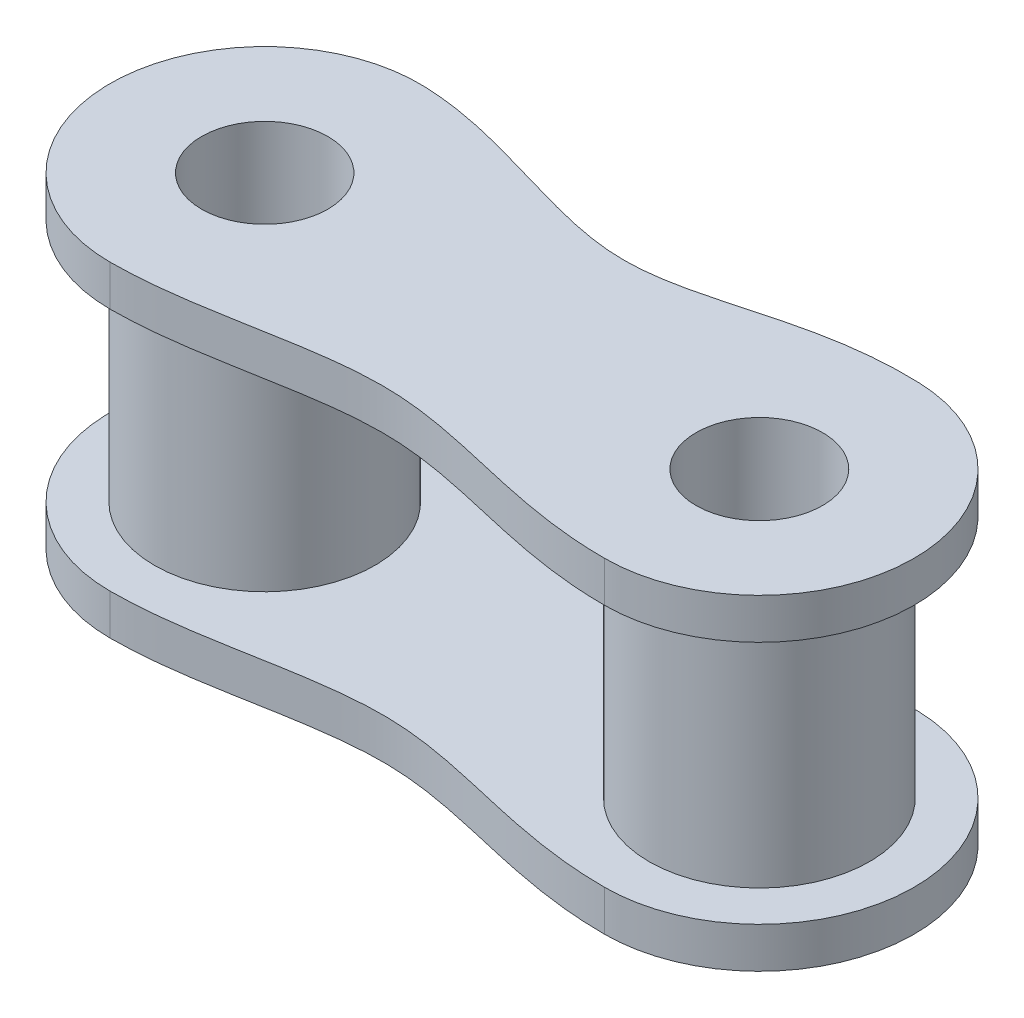
ISO-10303-21;
HEADER;
FILE_DESCRIPTION(('STEP AP214'),'2;1');
FILE_NAME('part.step','',(''),(''),'','','');
FILE_SCHEMA(('AUTOMOTIVE_DESIGN { 1 0 10303 214 1 1 1 1 }'));
ENDSEC;
DATA;
#1=APPLICATION_CONTEXT('core data for automotive mechanical design processes');
#2=APPLICATION_PROTOCOL_DEFINITION('international standard','automotive_design',2000,#1);
#3=PRODUCT_CONTEXT('',#1,'mechanical');
#4=PRODUCT('Part','Part','',(#3));
#5=PRODUCT_RELATED_PRODUCT_CATEGORY('part','',(#4));
#6=PRODUCT_DEFINITION_FORMATION('','',#4);
#7=PRODUCT_DEFINITION_CONTEXT('part definition',#1,'design');
#8=PRODUCT_DEFINITION('design','',#6,#7);
#9=PRODUCT_DEFINITION_SHAPE('','',#8);
#10=(LENGTH_UNIT() NAMED_UNIT(*) SI_UNIT(.MILLI.,.METRE.));
#11=(NAMED_UNIT(*) PLANE_ANGLE_UNIT() SI_UNIT($,.RADIAN.));
#12=(NAMED_UNIT(*) SI_UNIT($,.STERADIAN.) SOLID_ANGLE_UNIT());
#13=UNCERTAINTY_MEASURE_WITH_UNIT(LENGTH_MEASURE(1.E-05),#10,'distance_accuracy_value','');
#14=(GEOMETRIC_REPRESENTATION_CONTEXT(3) GLOBAL_UNCERTAINTY_ASSIGNED_CONTEXT((#13)) GLOBAL_UNIT_ASSIGNED_CONTEXT((#10,
#11,#12)) REPRESENTATION_CONTEXT('',''));
#15=CARTESIAN_POINT('',(0.,0.,0.));
#16=DIRECTION('',(0.,0.,1.));
#17=DIRECTION('',(1.,0.,0.));
#18=AXIS2_PLACEMENT_3D('',#15,#16,#17);
#19=CARTESIAN_POINT('',(-56.2357222874136,-3.,-24.7328680765328));
#20=DIRECTION('',(0.,1.,0.));
#21=DIRECTION('',(0.,0.,1.));
#22=AXIS2_PLACEMENT_3D('',#19,#20,#21);
#23=CYLINDRICAL_SURFACE('',#22,2.70829385594788);
#24=CARTESIAN_POINT('',(-56.2357222874136,-3.,-24.7328680765328));
#25=DIRECTION('',(0.,1.,0.));
#26=DIRECTION('',(0.,0.,1.));
#27=AXIS2_PLACEMENT_3D('',#24,#25,#26);
#28=CIRCLE('',#27,2.70829385594788);
#29=CARTESIAN_POINT('',(-56.2357222874136,-3.,-22.0245742205849));
#30=VERTEX_POINT('',#29);
#31=EDGE_CURVE('E41',#30,#30,#28,.T.);
#32=ORIENTED_EDGE('',*,*,#31,.T.);
#33=EDGE_LOOP('',(#32));
#34=FACE_BOUND('',#33,.T.);
#35=CARTESIAN_POINT('',(-56.2357222874136,3.,-24.7328680765328));
#36=DIRECTION('',(0.,1.,0.));
#37=DIRECTION('',(0.,0.,1.));
#38=AXIS2_PLACEMENT_3D('',#35,#36,#37);
#39=CIRCLE('',#38,2.70829385594788);
#40=CARTESIAN_POINT('',(-56.2357222874136,3.,-22.0245742205849));
#41=VERTEX_POINT('',#40);
#42=EDGE_CURVE('E11',#41,#41,#39,.T.);
#43=ORIENTED_EDGE('',*,*,#42,.F.);
#44=EDGE_LOOP('',(#43));
#45=FACE_BOUND('',#44,.T.);
#46=ADVANCED_FACE('F38',(#34,#45),#23,.T.);
#47=CARTESIAN_POINT('',(-56.2357222874136,3.,-24.7328680765328));
#48=DIRECTION('',(0.,-1.,0.));
#49=DIRECTION('',(0.,0.,-1.));
#50=AXIS2_PLACEMENT_3D('',#47,#48,#49);
#51=CYLINDRICAL_SURFACE('',#50,1.55000000000001);
#52=CARTESIAN_POINT('',(-56.2357222874136,-4.,-24.7328680765328));
#53=DIRECTION('',(0.,-1.,0.));
#54=DIRECTION('',(0.,0.,-1.));
#55=AXIS2_PLACEMENT_3D('',#52,#53,#54);
#56=CIRCLE('',#55,1.55000000000001);
#57=CARTESIAN_POINT('',(-56.2357222874136,-4.,-26.2828680765328));
#58=VERTEX_POINT('',#57);
#59=EDGE_CURVE('E223',#58,#58,#56,.F.);
#60=ORIENTED_EDGE('',*,*,#59,.F.);
#61=EDGE_LOOP('',(#60));
#62=FACE_BOUND('',#61,.T.);
#63=CARTESIAN_POINT('',(-56.2357222874136,4.,-24.7328680765328));
#64=DIRECTION('',(0.,1.,0.));
#65=DIRECTION('',(0.,0.,1.));
#66=AXIS2_PLACEMENT_3D('',#63,#64,#65);
#67=CIRCLE('',#66,1.55000000000001);
#68=CARTESIAN_POINT('',(-56.2357222874136,4.,-23.1828680765327));
#69=VERTEX_POINT('',#68);
#70=EDGE_CURVE('E226',#69,#69,#67,.T.);
#71=ORIENTED_EDGE('',*,*,#70,.T.);
#72=EDGE_LOOP('',(#71));
#73=FACE_BOUND('',#72,.T.);
#74=ADVANCED_FACE('F213',(#62,#73),#51,.F.);
#75=CARTESIAN_POINT('',(-56.2357222874136,-4.,-24.7328680765328));
#76=DIRECTION('',(0.,1.,0.));
#77=DIRECTION('',(0.,0.,1.));
#78=AXIS2_PLACEMENT_3D('',#75,#76,#77);
#79=CYLINDRICAL_SURFACE('',#78,3.8);
#80=CARTESIAN_POINT('',(-56.2357222874136,-3.,-24.7328680765328));
#81=DIRECTION('',(0.,-1.,0.));
#82=DIRECTION('',(0.,0.,-1.));
#83=AXIS2_PLACEMENT_3D('',#80,#81,#82);
#84=CIRCLE('',#83,3.8);
#85=CARTESIAN_POINT('',(-56.2357222874136,-3.,-20.9328680765328));
#86=VERTEX_POINT('',#85);
#87=CARTESIAN_POINT('',(-56.0930799373327,-3.,-28.5301899169834));
#88=VERTEX_POINT('',#87);
#89=EDGE_CURVE('E191',#86,#88,#84,.T.);
#90=ORIENTED_EDGE('',*,*,#89,.T.);
#91=DIRECTION('',(0.,1.,0.));
#92=VECTOR('',#91,1.);
#93=CARTESIAN_POINT('',(-56.0930799373327,-4.,-28.5301899169834));
#94=LINE('',#93,#92);
#95=CARTESIAN_POINT('',(-56.0930799373327,-4.,-28.5301899169834));
#96=VERTEX_POINT('',#95);
#97=EDGE_CURVE('E291',#96,#88,#94,.T.);
#98=ORIENTED_EDGE('',*,*,#97,.F.);
#99=CARTESIAN_POINT('',(-56.2357222874136,-4.,-24.7328680765328));
#100=DIRECTION('',(0.,-1.,0.));
#101=DIRECTION('',(0.,0.,-1.));
#102=AXIS2_PLACEMENT_3D('',#99,#100,#101);
#103=CIRCLE('',#102,3.8);
#104=CARTESIAN_POINT('',(-56.2357222874136,-4.,-20.9328680765328));
#105=VERTEX_POINT('',#104);
#106=EDGE_CURVE('E192',#105,#96,#103,.T.);
#107=ORIENTED_EDGE('',*,*,#106,.F.);
#108=DIRECTION('',(0.,1.,0.));
#109=VECTOR('',#108,1.);
#110=CARTESIAN_POINT('',(-56.2357222874136,-4.,-20.9328680765328));
#111=LINE('',#110,#109);
#112=EDGE_CURVE('E54',#105,#86,#111,.T.);
#113=ORIENTED_EDGE('',*,*,#112,.T.);
#114=EDGE_LOOP('',(#90,#98,#107,#113));
#115=FACE_BOUND('',#114,.T.);
#116=ADVANCED_FACE('F210',(#115),#79,.T.);
#117=CARTESIAN_POINT('',(-56.0930799373327,-4.,-28.5301899169834));
#118=CARTESIAN_POINT('',(-53.9425839833143,-4.,-28.4494088271497));
#119=CARTESIAN_POINT('',(-49.768599583636,-4.,-26.1494911176428));
#120=CARTESIAN_POINT('',(-46.4339773814745,-4.,-28.3981201507474));
#121=CARTESIAN_POINT('',(-43.7230178942518,-4.,-28.3033896752814));
#122=B_SPLINE_CURVE_WITH_KNOTS('',3,(#117,#118,#119,#120,#121),.UNSPECIFIED.,.F.,.F.,(4,1,4),
(0.,0.490575378656886,1.),.UNSPECIFIED.);
#123=DIRECTION('',(0.,1.,0.));
#124=VECTOR('',#123,1.);
#125=SURFACE_OF_LINEAR_EXTRUSION('',#122,#124);
#126=CARTESIAN_POINT('',(-56.0930799373327,-3.,-28.5301899169834));
#127=CARTESIAN_POINT('',(-53.9425839833143,-3.,-28.4494088271497));
#128=CARTESIAN_POINT('',(-49.768599583636,-3.,-26.1494911176428));
#129=CARTESIAN_POINT('',(-46.4339773814745,-3.,-28.3981201507474));
#130=CARTESIAN_POINT('',(-43.7230178942518,-3.,-28.3033896752814));
#131=B_SPLINE_CURVE_WITH_KNOTS('',3,(#126,#127,#128,#129,#130),.UNSPECIFIED.,.F.,.F.,(4,1,4),
(0.,0.490575378656886,1.),.UNSPECIFIED.);
#132=CARTESIAN_POINT('',(-43.7230178942518,-3.,-28.3033896752814));
#133=VERTEX_POINT('',#132);
#134=EDGE_CURVE('E270',#88,#133,#131,.T.);
#135=ORIENTED_EDGE('',*,*,#134,.T.);
#136=DIRECTION('',(0.,1.,0.));
#137=VECTOR('',#136,1.);
#138=CARTESIAN_POINT('',(-43.7230178942518,-4.,-28.3033896752814));
#139=LINE('',#138,#137);
#140=CARTESIAN_POINT('',(-43.7230178942518,-4.,-28.3033896752814));
#141=VERTEX_POINT('',#140);
#142=EDGE_CURVE('E288',#141,#133,#139,.T.);
#143=ORIENTED_EDGE('',*,*,#142,.F.);
#144=EDGE_CURVE('E82',#96,#141,#122,.T.);
#145=ORIENTED_EDGE('',*,*,#144,.F.);
#146=ORIENTED_EDGE('',*,*,#97,.T.);
#147=EDGE_LOOP('',(#135,#143,#145,#146));
#148=FACE_BOUND('',#147,.T.);
#149=ADVANCED_FACE('F205',(#148),#125,.F.);
#150=CARTESIAN_POINT('',(-43.8557222874136,-4.,-24.505707547452));
#151=DIRECTION('',(0.,1.,0.));
#152=DIRECTION('',(0.,0.,1.));
#153=AXIS2_PLACEMENT_3D('',#150,#151,#152);
#154=CYLINDRICAL_SURFACE('',#153,3.8);
#155=CARTESIAN_POINT('',(-43.8557222874136,-3.,-24.505707547452));
#156=DIRECTION('',(0.,-1.,0.));
#157=DIRECTION('',(0.,0.,-1.));
#158=AXIS2_PLACEMENT_3D('',#155,#156,#157);
#159=CIRCLE('',#158,3.8);
#160=CARTESIAN_POINT('',(-43.8557222874136,-3.,-20.705707547452));
#161=VERTEX_POINT('',#160);
#162=EDGE_CURVE('E274',#133,#161,#159,.T.);
#163=ORIENTED_EDGE('',*,*,#162,.T.);
#164=DIRECTION('',(0.,1.,0.));
#165=VECTOR('',#164,1.);
#166=CARTESIAN_POINT('',(-43.8557222874136,-4.,-20.705707547452));
#167=LINE('',#166,#165);
#168=CARTESIAN_POINT('',(-43.8557222874136,-4.,-20.705707547452));
#169=VERTEX_POINT('',#168);
#170=EDGE_CURVE('E70',#169,#161,#167,.T.);
#171=ORIENTED_EDGE('',*,*,#170,.F.);
#172=CARTESIAN_POINT('',(-43.8557222874136,-4.,-24.505707547452));
#173=DIRECTION('',(0.,-1.,0.));
#174=DIRECTION('',(0.,0.,-1.));
#175=AXIS2_PLACEMENT_3D('',#172,#173,#174);
#176=CIRCLE('',#175,3.8);
#177=EDGE_CURVE('E199',#141,#169,#176,.T.);
#178=ORIENTED_EDGE('',*,*,#177,.F.);
#179=ORIENTED_EDGE('',*,*,#142,.T.);
#180=EDGE_LOOP('',(#163,#171,#178,#179));
#181=FACE_BOUND('',#180,.T.);
#182=ADVANCED_FACE('F209',(#181),#154,.T.);
#183=CARTESIAN_POINT('',(-56.2357222874136,-4.,-20.9328680765328));
#184=CARTESIAN_POINT('',(-54.1058310477296,-4.,-20.9328680765328));
#185=CARTESIAN_POINT('',(-49.8960323415587,-4.,-22.477788173117));
#186=CARTESIAN_POINT('',(-46.252423284173,-4.,-20.705707547452));
#187=CARTESIAN_POINT('',(-43.8557222874136,-4.,-20.705707547452));
#188=B_SPLINE_CURVE_WITH_KNOTS('',3,(#183,#184,#185,#186,#187),.UNSPECIFIED.,.F.,.F.,(4,1,4),
(0.,0.498510270653624,1.),.UNSPECIFIED.);
#189=DIRECTION('',(0.,1.,0.));
#190=VECTOR('',#189,1.);
#191=SURFACE_OF_LINEAR_EXTRUSION('',#188,#190);
#192=CARTESIAN_POINT('',(-56.2357222874136,-3.,-20.9328680765328));
#193=CARTESIAN_POINT('',(-54.1058310477296,-3.,-20.9328680765328));
#194=CARTESIAN_POINT('',(-49.8960323415587,-3.,-22.477788173117));
#195=CARTESIAN_POINT('',(-46.252423284173,-3.,-20.705707547452));
#196=CARTESIAN_POINT('',(-43.8557222874136,-3.,-20.705707547452));
#197=B_SPLINE_CURVE_WITH_KNOTS('',3,(#192,#193,#194,#195,#196),.UNSPECIFIED.,.F.,.F.,(4,1,4),
(0.,0.498510270653624,1.),.UNSPECIFIED.);
#198=EDGE_CURVE('E194',#86,#161,#197,.T.);
#199=ORIENTED_EDGE('',*,*,#198,.F.);
#200=ORIENTED_EDGE('',*,*,#112,.F.);
#201=EDGE_CURVE('E258',#105,#169,#188,.T.);
#202=ORIENTED_EDGE('',*,*,#201,.T.);
#203=ORIENTED_EDGE('',*,*,#170,.T.);
#204=EDGE_LOOP('',(#199,#200,#202,#203));
#205=FACE_BOUND('',#204,.T.);
#206=ADVANCED_FACE('F246',(#205),#191,.T.);
#207=CARTESIAN_POINT('',(-43.8557222874136,-4.,-24.505707547452));
#208=DIRECTION('',(0.,1.,0.));
#209=DIRECTION('',(0.,0.,1.));
#210=AXIS2_PLACEMENT_3D('',#207,#208,#209);
#211=CYLINDRICAL_SURFACE('',#210,1.55389401911851);
#212=CARTESIAN_POINT('',(-43.8557222874136,-4.,-24.505707547452));
#213=DIRECTION('',(0.,-1.,0.));
#214=DIRECTION('',(0.,0.,-1.));
#215=AXIS2_PLACEMENT_3D('',#212,#213,#214);
#216=CIRCLE('',#215,1.55389401911851);
#217=CARTESIAN_POINT('',(-43.8557222874136,-4.,-26.0596015665705));
#218=VERTEX_POINT('',#217);
#219=EDGE_CURVE('E267',#218,#218,#216,.T.);
#220=ORIENTED_EDGE('',*,*,#219,.T.);
#221=EDGE_LOOP('',(#220));
#222=FACE_BOUND('',#221,.T.);
#223=CARTESIAN_POINT('',(-43.8557222874136,4.,-24.505707547452));
#224=DIRECTION('',(0.,1.,0.));
#225=DIRECTION('',(0.,0.,1.));
#226=AXIS2_PLACEMENT_3D('',#223,#224,#225);
#227=CIRCLE('',#226,1.55389401911851);
#228=CARTESIAN_POINT('',(-43.8557222874136,4.,-22.9518135283334));
#229=VERTEX_POINT('',#228);
#230=EDGE_CURVE('E228',#229,#229,#227,.T.);
#231=ORIENTED_EDGE('',*,*,#230,.T.);
#232=EDGE_LOOP('',(#231));
#233=FACE_BOUND('',#232,.T.);
#234=ADVANCED_FACE('F243',(#222,#233),#211,.F.);
#235=CARTESIAN_POINT('',(0.,-4.,0.));
#236=DIRECTION('',(0.,-1.,0.));
#237=DIRECTION('',(0.,0.,-1.));
#238=AXIS2_PLACEMENT_3D('',#235,#236,#237);
#239=PLANE('',#238);
#240=ORIENTED_EDGE('',*,*,#106,.T.);
#241=ORIENTED_EDGE('',*,*,#144,.T.);
#242=ORIENTED_EDGE('',*,*,#177,.T.);
#243=ORIENTED_EDGE('',*,*,#201,.F.);
#244=EDGE_LOOP('',(#240,#241,#242,#243));
#245=FACE_BOUND('',#244,.T.);
#246=ORIENTED_EDGE('',*,*,#59,.T.);
#247=EDGE_LOOP('',(#246));
#248=FACE_BOUND('',#247,.T.);
#249=ORIENTED_EDGE('',*,*,#219,.F.);
#250=EDGE_LOOP('',(#249));
#251=FACE_BOUND('',#250,.T.);
#252=ADVANCED_FACE('F245',(#245,#248,#251),#239,.T.);
#253=CARTESIAN_POINT('',(0.,-3.,0.));
#254=DIRECTION('',(0.,-1.,0.));
#255=DIRECTION('',(0.,0.,-1.));
#256=AXIS2_PLACEMENT_3D('',#253,#254,#255);
#257=PLANE('',#256);
#258=CARTESIAN_POINT('',(-43.8557222874136,-3.,-24.505707547452));
#259=DIRECTION('',(0.,1.,0.));
#260=DIRECTION('',(0.,0.,1.));
#261=AXIS2_PLACEMENT_3D('',#258,#259,#260);
#262=CIRCLE('',#261,2.70829385594788);
#263=CARTESIAN_POINT('',(-43.8557222874136,-3.,-21.7974136915041));
#264=VERTEX_POINT('',#263);
#265=EDGE_CURVE('E185',#264,#264,#262,.T.);
#266=ORIENTED_EDGE('',*,*,#265,.F.);
#267=EDGE_LOOP('',(#266));
#268=FACE_BOUND('',#267,.T.);
#269=ORIENTED_EDGE('',*,*,#31,.F.);
#270=EDGE_LOOP('',(#269));
#271=FACE_BOUND('',#270,.T.);
#272=ORIENTED_EDGE('',*,*,#89,.F.);
#273=ORIENTED_EDGE('',*,*,#198,.T.);
#274=ORIENTED_EDGE('',*,*,#162,.F.);
#275=ORIENTED_EDGE('',*,*,#134,.F.);
#276=EDGE_LOOP('',(#272,#273,#274,#275));
#277=FACE_BOUND('',#276,.T.);
#278=ADVANCED_FACE('F253',(#268,#271,#277),#257,.F.);
#279=CARTESIAN_POINT('',(-43.8557222874136,-3.,-24.505707547452));
#280=DIRECTION('',(0.,1.,0.));
#281=DIRECTION('',(0.,0.,1.));
#282=AXIS2_PLACEMENT_3D('',#279,#280,#281);
#283=CYLINDRICAL_SURFACE('',#282,2.70829385594788);
#284=ORIENTED_EDGE('',*,*,#265,.T.);
#285=EDGE_LOOP('',(#284));
#286=FACE_BOUND('',#285,.T.);
#287=CARTESIAN_POINT('',(-43.8557222874136,3.,-24.505707547452));
#288=DIRECTION('',(0.,1.,0.));
#289=DIRECTION('',(0.,0.,1.));
#290=AXIS2_PLACEMENT_3D('',#287,#288,#289);
#291=CIRCLE('',#290,2.70829385594788);
#292=CARTESIAN_POINT('',(-43.8557222874136,3.,-21.7974136915041));
#293=VERTEX_POINT('',#292);
#294=EDGE_CURVE('E188',#293,#293,#291,.T.);
#295=ORIENTED_EDGE('',*,*,#294,.F.);
#296=EDGE_LOOP('',(#295));
#297=FACE_BOUND('',#296,.T.);
#298=ADVANCED_FACE('F172',(#286,#297),#283,.T.);
#299=CARTESIAN_POINT('',(-49.9431240122215,4.,-27.2867748049801));
#300=DIRECTION('',(0.,-1.,0.));
#301=DIRECTION('',(0.,0.,-1.));
#302=AXIS2_PLACEMENT_3D('',#299,#300,#301);
#303=PLANE('',#302);
#304=CARTESIAN_POINT('',(-43.7230180726146,4.,-28.3033896815141));
#305=CARTESIAN_POINT('',(-43.8348939731687,4.,-28.3073098095554));
#306=CARTESIAN_POINT('',(-43.9468422647366,4.,-28.3091596214993));
#307=CARTESIAN_POINT('',(-44.1706784128979,4.,-28.3087260407409));
#308=CARTESIAN_POINT('',(-44.2825662732254,4.,-28.3064445847748));
#309=CARTESIAN_POINT('',(-44.506162875588,4.,-28.2977602788558));
#310=CARTESIAN_POINT('',(-44.6178716443498,4.,-28.2913581153322));
#311=CARTESIAN_POINT('',(-44.8399102294566,4.,-28.2746078253489));
#312=CARTESIAN_POINT('',(-44.9502429715003,4.,-28.2642982610563));
#313=CARTESIAN_POINT('',(-45.1704958017403,4.,-28.2398892383314));
#314=CARTESIAN_POINT('',(-45.2804158553131,4.,-28.2257894688093));
#315=CARTESIAN_POINT('',(-45.4997361690265,4.,-28.1940454703577));
#316=CARTESIAN_POINT('',(-45.6091364414264,4.,-28.1764013254525));
#317=CARTESIAN_POINT('',(-45.8889203456692,4.,-28.1270183380933));
#318=CARTESIAN_POINT('',(-46.0588923730681,4.,-28.0929432165107));
#319=CARTESIAN_POINT('',(-46.397437929297,4.,-28.0185226976403));
#320=CARTESIAN_POINT('',(-46.5660113783795,4.,-27.9781769453522));
#321=CARTESIAN_POINT('',(-46.9025566275397,4.,-27.8932315783601));
#322=CARTESIAN_POINT('',(-47.0705255002792,4.,-27.8486205760119));
#323=CARTESIAN_POINT('',(-47.4060391297165,4.,-27.7578784163426));
#324=CARTESIAN_POINT('',(-47.5735838948003,4.,-27.7117472893356));
#325=CARTESIAN_POINT('',(-47.8883958467822,4.,-27.626738704678));
#326=CARTESIAN_POINT('',(-48.0356101632732,4.,-27.5876693592196));
#327=CARTESIAN_POINT('',(-48.3308280462121,4.,-27.5133471440282));
#328=CARTESIAN_POINT('',(-48.4788303936289,4.,-27.4780895568882));
#329=CARTESIAN_POINT('',(-48.7762363115316,4.,-27.4141493705071));
#330=CARTESIAN_POINT('',(-48.9256394028182,4.,-27.3854646023949));
#331=CARTESIAN_POINT('',(-49.2224843586674,4.,-27.3382300372002));
#332=CARTESIAN_POINT('',(-49.3698885416976,4.,-27.3194557350825));
#333=CARTESIAN_POINT('',(-49.5917702809481,4.,-27.3001439743034));
#334=CARTESIAN_POINT('',(-49.665870187707,4.,-27.295181597006));
#335=CARTESIAN_POINT('',(-49.8142156214194,4.,-27.2884727103099));
#336=CARTESIAN_POINT('',(-49.8884611345023,4.,-27.2867259081982));
#337=CARTESIAN_POINT('',(-50.0368926166612,4.,-27.2867405393289));
#338=CARTESIAN_POINT('',(-50.1110785852423,4.,-27.2884991312913));
#339=CARTESIAN_POINT('',(-50.2592979208907,4.,-27.2953413143412));
#340=CARTESIAN_POINT('',(-50.3333312738879,4.,-27.3004251993519));
#341=CARTESIAN_POINT('',(-50.4869913343853,4.,-27.3140086999694));
#342=CARTESIAN_POINT('',(-50.5665966096726,4.,-27.3227469696423));
#343=CARTESIAN_POINT('',(-50.7254247491101,4.,-27.3431565113017));
#344=CARTESIAN_POINT('',(-50.8046476073786,4.,-27.3548278282523));
#345=CARTESIAN_POINT('',(-51.0419671539882,4.,-27.3936313135731));
#346=CARTESIAN_POINT('',(-51.1994482503466,4.,-27.4245265700107));
#347=CARTESIAN_POINT('',(-51.5129441697048,4.,-27.4933335584015));
#348=CARTESIAN_POINT('',(-51.6689576941598,4.,-27.5312509839312));
#349=CARTESIAN_POINT('',(-51.9833967625263,4.,-27.61251401182));
#350=CARTESIAN_POINT('',(-52.141794690289,4.,-27.6559648358486));
#351=CARTESIAN_POINT('',(-52.4577105067654,4.,-27.7452648167803));
#352=CARTESIAN_POINT('',(-52.6152291748794,4.,-27.7911112687537));
#353=CARTESIAN_POINT('',(-52.9301492446652,4.,-27.8832848440996));
#354=CARTESIAN_POINT('',(-53.0875506263543,4.,-27.9296120352491));
#355=CARTESIAN_POINT('',(-53.3626247295622,4.,-28.0093064620805));
#356=CARTESIAN_POINT('',(-53.4802106575882,4.,-28.0429706435612));
#357=CARTESIAN_POINT('',(-53.7158109179134,4.,-28.1088347417791));
#358=CARTESIAN_POINT('',(-53.8338253019727,4.,-28.1410344747837));
#359=CARTESIAN_POINT('',(-54.0703826104667,4.,-28.2032238191063));
#360=CARTESIAN_POINT('',(-54.1889252714166,4.,-28.233214424447));
#361=CARTESIAN_POINT('',(-54.4266384780119,4.,-28.2902428698576));
#362=CARTESIAN_POINT('',(-54.5458085331953,4.,-28.3172827359381));
#363=CARTESIAN_POINT('',(-54.7826839219004,4.,-28.3671996859983));
#364=CARTESIAN_POINT('',(-54.900374618544,4.,-28.390145529779));
#365=CARTESIAN_POINT('',(-55.1365567616456,4.,-28.4317539314523));
#366=CARTESIAN_POINT('',(-55.2550484486826,4.,-28.4504151377109));
#367=CARTESIAN_POINT('',(-55.492939595466,4.,-28.482716276058));
#368=CARTESIAN_POINT('',(-55.6123402765976,4.,-28.4963474084061));
#369=CARTESIAN_POINT('',(-55.8521310166892,4.,-28.517834851425));
#370=CARTESIAN_POINT('',(-55.9725231212509,4.,-28.5256680720541));
#371=CARTESIAN_POINT('',(-56.0930798761758,4.,-28.5301899146861));
#372=B_SPLINE_CURVE_WITH_KNOTS('',3,(#304,#305,#306,#307,#308,#309,#310,#311,#312,#313,#314,
#315,#316,#317,#318,#319,#320,#321,#322,#323,#324,#325,#326,#327,#328,#329,#330,#331,#332,#333,
#334,#335,#336,#337,#338,#339,#340,#341,#342,#343,#344,#345,#346,#347,#348,#349,#350,#351,#352,
#353,#354,#355,#356,#357,#358,#359,#360,#361,#362,#363,#364,#365,#366,#367,#368,#369,#370,#371),
.UNSPECIFIED.,.F.,.F.,(4,2,2,2,2,2,2,2,2,2,2,2,2,2,2,2,2,2,2,2,2,2,2,2,2,2,2,2,2,2,2,2,2,4),(0.,
0.335814415876688,0.671471442894381,1.00707257047639,1.33944443010605,1.67184357826069,
2.00423484736026,2.52412902685489,3.04405264993401,3.56540537144471,4.08674770247402,
4.5436618792196,5.00000394771581,5.45619521682721,5.90155301062142,6.12429221693627,
6.3470111463558,6.56954962544802,6.79210777742185,7.03229403415555,7.27248397321963,
7.75366581559246,8.23523952209997,8.72794595332348,9.22010760469053,9.71233961246984,
10.0792643289086,10.4462349541669,10.8130394350804,11.179590457907,11.5392437414175,
11.8990103259258,12.2594033445752,12.6212240090576),.UNSPECIFIED.);
#373=CARTESIAN_POINT('',(-43.7230180726146,4.,-28.3033896815141));
#374=VERTEX_POINT('',#373);
#375=CARTESIAN_POINT('',(-56.0930798761758,4.,-28.5301899146861));
#376=VERTEX_POINT('',#375);
#377=EDGE_CURVE('E135',#374,#376,#372,.T.);
#378=ORIENTED_EDGE('',*,*,#377,.T.);
#379=CARTESIAN_POINT('',(-56.2357222874136,4.,-24.7328680765328));
#380=DIRECTION('',(0.,1.,0.));
#381=DIRECTION('',(0.,0.,1.));
#382=AXIS2_PLACEMENT_3D('',#379,#380,#381);
#383=CIRCLE('',#382,3.8);
#384=CARTESIAN_POINT('',(-56.2357221826512,4.,-20.9328680765328));
#385=VERTEX_POINT('',#384);
#386=EDGE_CURVE('E167',#376,#385,#383,.T.);
#387=ORIENTED_EDGE('',*,*,#386,.T.);
#388=CARTESIAN_POINT('',(-56.2357221826512,4.,-20.9328680765328));
#389=CARTESIAN_POINT('',(-56.1147737121892,4.,-20.9328655122562));
#390=CARTESIAN_POINT('',(-55.9938487970871,4.,-20.935351571652));
#391=CARTESIAN_POINT('',(-55.7526065792318,4.,-20.9446994933363));
#392=CARTESIAN_POINT('',(-55.6322886692468,4.,-20.9515453583167));
#393=CARTESIAN_POINT('',(-55.3921833904005,4.,-20.9690020563442));
#394=CARTESIAN_POINT('',(-55.2723954394686,4.,-20.9796051324445));
#395=CARTESIAN_POINT('',(-55.0332577668891,4.,-21.0039886817314));
#396=CARTESIAN_POINT('',(-54.9139077458227,4.,-21.017766257224));
#397=CARTESIAN_POINT('',(-54.6755596425833,4.,-21.0479317471856));
#398=CARTESIAN_POINT('',(-54.5565615127585,4.,-21.0643192900269));
#399=CARTESIAN_POINT('',(-54.3183123320822,4.,-21.0992260225551));
#400=CARTESIAN_POINT('',(-54.1990627058738,4.,-21.1177548339454));
#401=CARTESIAN_POINT('',(-53.9607407149319,4.,-21.1563310837303));
#402=CARTESIAN_POINT('',(-53.8416684933382,4.,-21.1763793977029));
#403=CARTESIAN_POINT('',(-53.6036113734391,4.,-21.2174393286298));
#404=CARTESIAN_POINT('',(-53.4846265836041,4.,-21.2384515686725));
#405=CARTESIAN_POINT('',(-53.2466532650853,4.,-21.2808772364031));
#406=CARTESIAN_POINT('',(-53.1276647795972,4.,-21.3022909041651));
#407=CARTESIAN_POINT('',(-52.8895905994085,4.,-21.3449437338655));
#408=CARTESIAN_POINT('',(-52.77050488674,4.,-21.3661827964346));
#409=CARTESIAN_POINT('',(-52.5319103930923,4.,-21.4079299619503));
#410=CARTESIAN_POINT('',(-52.4124012815683,4.,-21.4284361945427));
#411=CARTESIAN_POINT('',(-52.1731733741283,4.,-21.468031273774));
#412=CARTESIAN_POINT('',(-52.0534546311048,4.,-21.4871204364862));
#413=CARTESIAN_POINT('',(-51.8137785230534,4.,-21.5232075191085));
#414=CARTESIAN_POINT('',(-51.6938213657953,4.,-21.5402068011681));
#415=CARTESIAN_POINT('',(-51.4536341815891,4.,-21.5714020984209));
#416=CARTESIAN_POINT('',(-51.3334044461342,4.,-21.5856003239515));
#417=CARTESIAN_POINT('',(-51.0926304998739,4.,-21.6104386189128));
#418=CARTESIAN_POINT('',(-50.9720864767936,4.,-21.6210804673767));
#419=CARTESIAN_POINT('',(-50.7307548140129,4.,-21.637986298648));
#420=CARTESIAN_POINT('',(-50.6099673582293,4.,-21.6442528405435));
#421=CARTESIAN_POINT('',(-50.3681728009285,4.,-21.6515675904122));
#422=CARTESIAN_POINT('',(-50.247165638223,4.,-21.6526140054524));
#423=CARTESIAN_POINT('',(-50.0657287210114,4.,-21.6495556521763));
#424=CARTESIAN_POINT('',(-50.0052558679605,4.,-21.6477644515488));
#425=CARTESIAN_POINT('',(-49.8843753708265,4.,-21.6426380964488));
#426=CARTESIAN_POINT('',(-49.8239677276686,4.,-21.6393029203522));
#427=CARTESIAN_POINT('',(-49.642846392216,4.,-21.6271436775873));
#428=CARTESIAN_POINT('',(-49.5222735971314,4.,-21.616166664759));
#429=CARTESIAN_POINT('',(-49.2816990933558,4.,-21.5892935771263));
#430=CARTESIAN_POINT('',(-49.1616973672672,4.,-21.5733976531628));
#431=CARTESIAN_POINT('',(-48.8984165759681,4.,-21.5340115180534));
#432=CARTESIAN_POINT('',(-48.7552710886653,4.,-21.5096388418551));
#433=CARTESIAN_POINT('',(-48.4697595222301,4.,-21.4566679953109));
#434=CARTESIAN_POINT('',(-48.327393568126,4.,-21.4280691666009));
#435=CARTESIAN_POINT('',(-48.0431582557527,4.,-21.3681516855149));
#436=CARTESIAN_POINT('',(-47.9012892318174,4.,-21.3368314716946));
#437=CARTESIAN_POINT('',(-47.6177842773446,4.,-21.2729100303159));
#438=CARTESIAN_POINT('',(-47.4761484643826,4.,-21.2403082894351));
#439=CARTESIAN_POINT('',(-47.1928645614646,4.,-21.1751769019697));
#440=CARTESIAN_POINT('',(-47.0512164720247,4.,-21.1426472531833));
#441=CARTESIAN_POINT('',(-46.767686221238,4.,-21.078910652953));
#442=CARTESIAN_POINT('',(-46.6258041939808,4.,-21.0477031126201));
#443=CARTESIAN_POINT('',(-46.3400476432441,4.,-20.9874166206906));
#444=CARTESIAN_POINT('',(-46.196167697437,4.,-20.958363046691));
#445=CARTESIAN_POINT('',(-45.9077928744378,4.,-20.90381228158));
#446=CARTESIAN_POINT('',(-45.7632982975974,4.,-20.8783135221162));
#447=CARTESIAN_POINT('',(-45.4735042119299,4.,-20.8317753409449));
#448=CARTESIAN_POINT('',(-45.3282043125165,4.,-20.8107383212939));
#449=CARTESIAN_POINT('',(-45.0366274591904,4.,-20.7738931462519));
#450=CARTESIAN_POINT('',(-44.8903491005647,4.,-20.7580959731284));
#451=CARTESIAN_POINT('',(-44.596654103929,4.,-20.7323902662632));
#452=CARTESIAN_POINT('',(-44.4492352616654,4.,-20.7225064681761));
#453=CARTESIAN_POINT('',(-44.1531264204723,4.,-20.709127379112));
#454=CARTESIAN_POINT('',(-44.0044344980426,4.,-20.7056751074032));
#455=CARTESIAN_POINT('',(-43.8557224512393,4.,-20.705707547452));
#456=B_SPLINE_CURVE_WITH_KNOTS('',3,(#388,#389,#390,#391,#392,#393,#394,#395,#396,#397,#398,
#399,#400,#401,#402,#403,#404,#405,#406,#407,#408,#409,#410,#411,#412,#413,#414,#415,#416,#417,
#418,#419,#420,#421,#422,#423,#424,#425,#426,#427,#428,#429,#430,#431,#432,#433,#434,#435,#436,
#437,#438,#439,#440,#441,#442,#443,#444,#445,#446,#447,#448,#449,#450,#451,#452,#453,#454,#455),
.UNSPECIFIED.,.F.,.F.,(4,2,2,2,2,2,2,2,2,2,2,2,2,2,2,2,2,2,2,2,2,2,2,2,2,2,2,2,2,2,2,2,2,4),(0.,
0.362785708077187,0.724247866977957,1.08496807619498,1.44536031412957,1.80570128237475,
2.16772947018194,2.52996787796361,2.89244383263383,3.25514395703206,3.61803790451625,
3.98180005814627,4.3454808303621,4.7089232904191,5.0720777975971,5.43505036839511,
5.7978104606721,6.16069513991418,6.3421746292147,6.52365666029934,6.88673852602307,
7.24980925874821,7.68533190512048,8.12092247031866,8.55676463512668,8.99278319424891,
9.42878824752465,9.86459701006232,10.3049169703371,10.7450420463852,11.1854034734287,
11.6266821125225,12.0697939444092,12.5158591715672),.UNSPECIFIED.);
#457=CARTESIAN_POINT('',(-43.8557224512393,4.,-20.705707547452));
#458=VERTEX_POINT('',#457);
#459=EDGE_CURVE('E128',#385,#458,#456,.T.);
#460=ORIENTED_EDGE('',*,*,#459,.T.);
#461=CARTESIAN_POINT('',(-43.8557222874136,4.,-24.505707547452));
#462=DIRECTION('',(0.,1.,0.));
#463=DIRECTION('',(0.,0.,1.));
#464=AXIS2_PLACEMENT_3D('',#461,#462,#463);
#465=CIRCLE('',#464,3.8);
#466=EDGE_CURVE('E166',#458,#374,#465,.T.);
#467=ORIENTED_EDGE('',*,*,#466,.T.);
#468=EDGE_LOOP('',(#378,#387,#460,#467));
#469=FACE_BOUND('',#468,.T.);
#470=ORIENTED_EDGE('',*,*,#70,.F.);
#471=EDGE_LOOP('',(#470));
#472=FACE_BOUND('',#471,.T.);
#473=ORIENTED_EDGE('',*,*,#230,.F.);
#474=EDGE_LOOP('',(#473));
#475=FACE_BOUND('',#474,.T.);
#476=ADVANCED_FACE('F169',(#469,#472,#475),#303,.F.);
#477=CARTESIAN_POINT('',(-49.9431240122215,3.,-27.2867748049801));
#478=DIRECTION('',(0.,-1.,0.));
#479=DIRECTION('',(0.,0.,-1.));
#480=AXIS2_PLACEMENT_3D('',#477,#478,#479);
#481=PLANE('',#480);
#482=ORIENTED_EDGE('',*,*,#42,.T.);
#483=EDGE_LOOP('',(#482));
#484=FACE_BOUND('',#483,.T.);
#485=ORIENTED_EDGE('',*,*,#294,.T.);
#486=EDGE_LOOP('',(#485));
#487=FACE_BOUND('',#486,.T.);
#488=CARTESIAN_POINT('',(-43.7230180726146,3.,-28.3033896815141));
#489=CARTESIAN_POINT('',(-43.8348939731687,3.,-28.3073098095554));
#490=CARTESIAN_POINT('',(-43.9468422647366,3.,-28.3091596214993));
#491=CARTESIAN_POINT('',(-44.1706784128979,3.,-28.3087260407409));
#492=CARTESIAN_POINT('',(-44.2825662732254,3.,-28.3064445847748));
#493=CARTESIAN_POINT('',(-44.506162875588,3.,-28.2977602788558));
#494=CARTESIAN_POINT('',(-44.6178716443498,3.,-28.2913581153322));
#495=CARTESIAN_POINT('',(-44.8399102294566,3.,-28.2746078253489));
#496=CARTESIAN_POINT('',(-44.9502429715003,3.,-28.2642982610563));
#497=CARTESIAN_POINT('',(-45.1704958017403,3.,-28.2398892383314));
#498=CARTESIAN_POINT('',(-45.2804158553131,3.,-28.2257894688093));
#499=CARTESIAN_POINT('',(-45.4997361690265,3.,-28.1940454703577));
#500=CARTESIAN_POINT('',(-45.6091364414264,3.,-28.1764013254525));
#501=CARTESIAN_POINT('',(-45.8889203456692,3.,-28.1270183380933));
#502=CARTESIAN_POINT('',(-46.0588923730681,3.,-28.0929432165107));
#503=CARTESIAN_POINT('',(-46.397437929297,3.,-28.0185226976403));
#504=CARTESIAN_POINT('',(-46.5660113783795,3.,-27.9781769453522));
#505=CARTESIAN_POINT('',(-46.9025566275397,3.,-27.8932315783601));
#506=CARTESIAN_POINT('',(-47.0705255002792,3.,-27.8486205760119));
#507=CARTESIAN_POINT('',(-47.4060391297165,3.,-27.7578784163426));
#508=CARTESIAN_POINT('',(-47.5735838948003,3.,-27.7117472893356));
#509=CARTESIAN_POINT('',(-47.8883958467822,3.,-27.626738704678));
#510=CARTESIAN_POINT('',(-48.0356101632732,3.,-27.5876693592196));
#511=CARTESIAN_POINT('',(-48.3308280462121,3.,-27.5133471440282));
#512=CARTESIAN_POINT('',(-48.4788303936289,3.,-27.4780895568882));
#513=CARTESIAN_POINT('',(-48.7762363115316,3.,-27.4141493705071));
#514=CARTESIAN_POINT('',(-48.9256394028182,3.,-27.3854646023949));
#515=CARTESIAN_POINT('',(-49.2224843586674,3.,-27.3382300372002));
#516=CARTESIAN_POINT('',(-49.3698885416976,3.,-27.3194557350825));
#517=CARTESIAN_POINT('',(-49.5917702809481,3.,-27.3001439743034));
#518=CARTESIAN_POINT('',(-49.665870187707,3.,-27.295181597006));
#519=CARTESIAN_POINT('',(-49.8142156214194,3.,-27.2884727103099));
#520=CARTESIAN_POINT('',(-49.8884611345023,3.,-27.2867259081982));
#521=CARTESIAN_POINT('',(-50.0368926166612,3.,-27.2867405393289));
#522=CARTESIAN_POINT('',(-50.1110785852423,3.,-27.2884991312913));
#523=CARTESIAN_POINT('',(-50.2592979208907,3.,-27.2953413143412));
#524=CARTESIAN_POINT('',(-50.3333312738879,3.,-27.3004251993519));
#525=CARTESIAN_POINT('',(-50.4869913343853,3.,-27.3140086999694));
#526=CARTESIAN_POINT('',(-50.5665966096726,3.,-27.3227469696423));
#527=CARTESIAN_POINT('',(-50.7254247491101,3.,-27.3431565113017));
#528=CARTESIAN_POINT('',(-50.8046476073786,3.,-27.3548278282523));
#529=CARTESIAN_POINT('',(-51.0419671539882,3.,-27.3936313135731));
#530=CARTESIAN_POINT('',(-51.1994482503466,3.,-27.4245265700107));
#531=CARTESIAN_POINT('',(-51.5129441697048,3.,-27.4933335584015));
#532=CARTESIAN_POINT('',(-51.6689576941598,3.,-27.5312509839312));
#533=CARTESIAN_POINT('',(-51.9833967625263,3.,-27.61251401182));
#534=CARTESIAN_POINT('',(-52.141794690289,3.,-27.6559648358486));
#535=CARTESIAN_POINT('',(-52.4577105067654,3.,-27.7452648167803));
#536=CARTESIAN_POINT('',(-52.6152291748794,3.,-27.7911112687537));
#537=CARTESIAN_POINT('',(-52.9301492446652,3.,-27.8832848440996));
#538=CARTESIAN_POINT('',(-53.0875506263543,3.,-27.9296120352491));
#539=CARTESIAN_POINT('',(-53.3626247295622,3.,-28.0093064620805));
#540=CARTESIAN_POINT('',(-53.4802106575882,3.,-28.0429706435612));
#541=CARTESIAN_POINT('',(-53.7158109179134,3.,-28.1088347417791));
#542=CARTESIAN_POINT('',(-53.8338253019727,3.,-28.1410344747837));
#543=CARTESIAN_POINT('',(-54.0703826104667,3.,-28.2032238191063));
#544=CARTESIAN_POINT('',(-54.1889252714166,3.,-28.233214424447));
#545=CARTESIAN_POINT('',(-54.4266384780119,3.,-28.2902428698576));
#546=CARTESIAN_POINT('',(-54.5458085331953,3.,-28.3172827359381));
#547=CARTESIAN_POINT('',(-54.7826839219004,3.,-28.3671996859983));
#548=CARTESIAN_POINT('',(-54.900374618544,3.,-28.390145529779));
#549=CARTESIAN_POINT('',(-55.1365567616456,3.,-28.4317539314523));
#550=CARTESIAN_POINT('',(-55.2550484486826,3.,-28.4504151377109));
#551=CARTESIAN_POINT('',(-55.492939595466,3.,-28.482716276058));
#552=CARTESIAN_POINT('',(-55.6123402765976,3.,-28.4963474084061));
#553=CARTESIAN_POINT('',(-55.8521310166892,3.,-28.517834851425));
#554=CARTESIAN_POINT('',(-55.9725231212509,3.,-28.5256680720541));
#555=CARTESIAN_POINT('',(-56.0930798761758,3.,-28.5301899146861));
#556=B_SPLINE_CURVE_WITH_KNOTS('',3,(#488,#489,#490,#491,#492,#493,#494,#495,#496,#497,#498,
#499,#500,#501,#502,#503,#504,#505,#506,#507,#508,#509,#510,#511,#512,#513,#514,#515,#516,#517,
#518,#519,#520,#521,#522,#523,#524,#525,#526,#527,#528,#529,#530,#531,#532,#533,#534,#535,#536,
#537,#538,#539,#540,#541,#542,#543,#544,#545,#546,#547,#548,#549,#550,#551,#552,#553,#554,#555),
.UNSPECIFIED.,.F.,.F.,(4,2,2,2,2,2,2,2,2,2,2,2,2,2,2,2,2,2,2,2,2,2,2,2,2,2,2,2,2,2,2,2,2,4),(0.,
0.335814415876688,0.671471442894381,1.00707257047639,1.33944443010605,1.67184357826069,
2.00423484736026,2.52412902685489,3.04405264993401,3.56540537144471,4.08674770247402,
4.5436618792196,5.00000394771581,5.45619521682721,5.90155301062142,6.12429221693627,
6.3470111463558,6.56954962544802,6.79210777742185,7.03229403415555,7.27248397321963,
7.75366581559246,8.23523952209997,8.72794595332348,9.22010760469053,9.71233961246984,
10.0792643289086,10.4462349541669,10.8130394350804,11.179590457907,11.5392437414175,
11.8990103259258,12.2594033445752,12.6212240090576),.UNSPECIFIED.);
#557=CARTESIAN_POINT('',(-43.7230180726146,3.,-28.3033896815141));
#558=VERTEX_POINT('',#557);
#559=CARTESIAN_POINT('',(-56.0930798761758,3.,-28.5301899146861));
#560=VERTEX_POINT('',#559);
#561=EDGE_CURVE('E122',#558,#560,#556,.T.);
#562=ORIENTED_EDGE('',*,*,#561,.F.);
#563=CARTESIAN_POINT('',(-43.8557222874136,3.,-24.505707547452));
#564=DIRECTION('',(0.,1.,0.));
#565=DIRECTION('',(0.,0.,1.));
#566=AXIS2_PLACEMENT_3D('',#563,#564,#565);
#567=CIRCLE('',#566,3.8);
#568=CARTESIAN_POINT('',(-43.8557224512393,3.,-20.705707547452));
#569=VERTEX_POINT('',#568);
#570=EDGE_CURVE('E133',#569,#558,#567,.T.);
#571=ORIENTED_EDGE('',*,*,#570,.F.);
#572=CARTESIAN_POINT('',(-56.2357221826512,3.,-20.9328680765328));
#573=CARTESIAN_POINT('',(-56.1147737121892,3.,-20.9328655122562));
#574=CARTESIAN_POINT('',(-55.9938487970871,3.,-20.935351571652));
#575=CARTESIAN_POINT('',(-55.7526065792318,3.,-20.9446994933363));
#576=CARTESIAN_POINT('',(-55.6322886692468,3.,-20.9515453583167));
#577=CARTESIAN_POINT('',(-55.3921833904005,3.,-20.9690020563442));
#578=CARTESIAN_POINT('',(-55.2723954394686,3.,-20.9796051324445));
#579=CARTESIAN_POINT('',(-55.0332577668891,3.,-21.0039886817314));
#580=CARTESIAN_POINT('',(-54.9139077458227,3.,-21.017766257224));
#581=CARTESIAN_POINT('',(-54.6755596425833,3.,-21.0479317471856));
#582=CARTESIAN_POINT('',(-54.5565615127585,3.,-21.0643192900269));
#583=CARTESIAN_POINT('',(-54.3183123320822,3.,-21.0992260225551));
#584=CARTESIAN_POINT('',(-54.1990627058738,3.,-21.1177548339454));
#585=CARTESIAN_POINT('',(-53.9607407149319,3.,-21.1563310837303));
#586=CARTESIAN_POINT('',(-53.8416684933382,3.,-21.1763793977029));
#587=CARTESIAN_POINT('',(-53.6036113734391,3.,-21.2174393286298));
#588=CARTESIAN_POINT('',(-53.4846265836041,3.,-21.2384515686725));
#589=CARTESIAN_POINT('',(-53.2466532650853,3.,-21.2808772364031));
#590=CARTESIAN_POINT('',(-53.1276647795972,3.,-21.3022909041651));
#591=CARTESIAN_POINT('',(-52.8895905994085,3.,-21.3449437338655));
#592=CARTESIAN_POINT('',(-52.77050488674,3.,-21.3661827964346));
#593=CARTESIAN_POINT('',(-52.5319103930923,3.,-21.4079299619503));
#594=CARTESIAN_POINT('',(-52.4124012815683,3.,-21.4284361945427));
#595=CARTESIAN_POINT('',(-52.1731733741283,3.,-21.468031273774));
#596=CARTESIAN_POINT('',(-52.0534546311048,3.,-21.4871204364862));
#597=CARTESIAN_POINT('',(-51.8137785230534,3.,-21.5232075191085));
#598=CARTESIAN_POINT('',(-51.6938213657953,3.,-21.5402068011681));
#599=CARTESIAN_POINT('',(-51.4536341815891,3.,-21.5714020984209));
#600=CARTESIAN_POINT('',(-51.3334044461342,3.,-21.5856003239515));
#601=CARTESIAN_POINT('',(-51.0926304998739,3.,-21.6104386189128));
#602=CARTESIAN_POINT('',(-50.9720864767936,3.,-21.6210804673767));
#603=CARTESIAN_POINT('',(-50.7307548140129,3.,-21.637986298648));
#604=CARTESIAN_POINT('',(-50.6099673582293,3.,-21.6442528405435));
#605=CARTESIAN_POINT('',(-50.3681728009285,3.,-21.6515675904122));
#606=CARTESIAN_POINT('',(-50.247165638223,3.,-21.6526140054524));
#607=CARTESIAN_POINT('',(-50.0657287210114,3.,-21.6495556521763));
#608=CARTESIAN_POINT('',(-50.0052558679605,3.,-21.6477644515488));
#609=CARTESIAN_POINT('',(-49.8843753708265,3.,-21.6426380964488));
#610=CARTESIAN_POINT('',(-49.8239677276686,3.,-21.6393029203522));
#611=CARTESIAN_POINT('',(-49.642846392216,3.,-21.6271436775873));
#612=CARTESIAN_POINT('',(-49.5222735971314,3.,-21.616166664759));
#613=CARTESIAN_POINT('',(-49.2816990933558,3.,-21.5892935771263));
#614=CARTESIAN_POINT('',(-49.1616973672672,3.,-21.5733976531628));
#615=CARTESIAN_POINT('',(-48.8984165759681,3.,-21.5340115180534));
#616=CARTESIAN_POINT('',(-48.7552710886653,3.,-21.5096388418551));
#617=CARTESIAN_POINT('',(-48.4697595222301,3.,-21.4566679953109));
#618=CARTESIAN_POINT('',(-48.327393568126,3.,-21.4280691666009));
#619=CARTESIAN_POINT('',(-48.0431582557527,3.,-21.3681516855149));
#620=CARTESIAN_POINT('',(-47.9012892318174,3.,-21.3368314716946));
#621=CARTESIAN_POINT('',(-47.6177842773446,3.,-21.2729100303159));
#622=CARTESIAN_POINT('',(-47.4761484643826,3.,-21.2403082894351));
#623=CARTESIAN_POINT('',(-47.1928645614646,3.,-21.1751769019697));
#624=CARTESIAN_POINT('',(-47.0512164720247,3.,-21.1426472531833));
#625=CARTESIAN_POINT('',(-46.767686221238,3.,-21.078910652953));
#626=CARTESIAN_POINT('',(-46.6258041939808,3.,-21.0477031126201));
#627=CARTESIAN_POINT('',(-46.3400476432441,3.,-20.9874166206906));
#628=CARTESIAN_POINT('',(-46.196167697437,3.,-20.958363046691));
#629=CARTESIAN_POINT('',(-45.9077928744378,3.,-20.90381228158));
#630=CARTESIAN_POINT('',(-45.7632982975974,3.,-20.8783135221162));
#631=CARTESIAN_POINT('',(-45.4735042119299,3.,-20.8317753409449));
#632=CARTESIAN_POINT('',(-45.3282043125165,3.,-20.8107383212939));
#633=CARTESIAN_POINT('',(-45.0366274591904,3.,-20.7738931462519));
#634=CARTESIAN_POINT('',(-44.8903491005647,3.,-20.7580959731284));
#635=CARTESIAN_POINT('',(-44.596654103929,3.,-20.7323902662632));
#636=CARTESIAN_POINT('',(-44.4492352616654,3.,-20.7225064681761));
#637=CARTESIAN_POINT('',(-44.1531264204723,3.,-20.709127379112));
#638=CARTESIAN_POINT('',(-44.0044344980426,3.,-20.7056751074032));
#639=CARTESIAN_POINT('',(-43.8557224512393,3.,-20.705707547452));
#640=B_SPLINE_CURVE_WITH_KNOTS('',3,(#572,#573,#574,#575,#576,#577,#578,#579,#580,#581,#582,
#583,#584,#585,#586,#587,#588,#589,#590,#591,#592,#593,#594,#595,#596,#597,#598,#599,#600,#601,
#602,#603,#604,#605,#606,#607,#608,#609,#610,#611,#612,#613,#614,#615,#616,#617,#618,#619,#620,
#621,#622,#623,#624,#625,#626,#627,#628,#629,#630,#631,#632,#633,#634,#635,#636,#637,#638,#639),
.UNSPECIFIED.,.F.,.F.,(4,2,2,2,2,2,2,2,2,2,2,2,2,2,2,2,2,2,2,2,2,2,2,2,2,2,2,2,2,2,2,2,2,4),(0.,
0.362785708077187,0.724247866977957,1.08496807619498,1.44536031412957,1.80570128237475,
2.16772947018194,2.52996787796361,2.89244383263383,3.25514395703206,3.61803790451625,
3.98180005814627,4.3454808303621,4.7089232904191,5.0720777975971,5.43505036839511,
5.7978104606721,6.16069513991418,6.3421746292147,6.52365666029934,6.88673852602307,
7.24980925874821,7.68533190512048,8.12092247031866,8.55676463512668,8.99278319424891,
9.42878824752465,9.86459701006232,10.3049169703371,10.7450420463852,11.1854034734287,
11.6266821125225,12.0697939444092,12.5158591715672),.UNSPECIFIED.);
#641=CARTESIAN_POINT('',(-56.2357221826512,3.,-20.9328680765328));
#642=VERTEX_POINT('',#641);
#643=EDGE_CURVE('E121',#642,#569,#640,.T.);
#644=ORIENTED_EDGE('',*,*,#643,.F.);
#645=CARTESIAN_POINT('',(-56.2357222874136,3.,-24.7328680765328));
#646=DIRECTION('',(0.,1.,0.));
#647=DIRECTION('',(0.,0.,1.));
#648=AXIS2_PLACEMENT_3D('',#645,#646,#647);
#649=CIRCLE('',#648,3.8);
#650=EDGE_CURVE('E110',#560,#642,#649,.T.);
#651=ORIENTED_EDGE('',*,*,#650,.F.);
#652=EDGE_LOOP('',(#562,#571,#644,#651));
#653=FACE_BOUND('',#652,.T.);
#654=ADVANCED_FACE('F132',(#484,#487,#653),#481,.T.);
#655=CARTESIAN_POINT('',(-56.0930799373327,-4.,-28.5301899169834));
#656=CARTESIAN_POINT('',(-53.9425839833143,-4.,-28.4494088271497));
#657=CARTESIAN_POINT('',(-49.768599583636,-4.,-26.1494911176428));
#658=CARTESIAN_POINT('',(-46.4339773814745,-4.,-28.3981201507474));
#659=CARTESIAN_POINT('',(-43.7230178942518,-4.,-28.3033896752814));
#660=B_SPLINE_CURVE_WITH_KNOTS('',3,(#655,#656,#657,#658,#659),.UNSPECIFIED.,.F.,.F.,(4,1,4),
(0.,0.490575378656886,1.),.UNSPECIFIED.);
#661=DIRECTION('',(0.,1.,0.));
#662=VECTOR('',#661,1.);
#663=SURFACE_OF_LINEAR_EXTRUSION('',#660,#662);
#664=ORIENTED_EDGE('',*,*,#561,.T.);
#665=DIRECTION('',(0.,1.,0.));
#666=VECTOR('',#665,1.);
#667=CARTESIAN_POINT('',(-56.0930799373327,3.5,-28.5301899169834));
#668=LINE('',#667,#666);
#669=EDGE_CURVE('E116',#376,#560,#668,.F.);
#670=ORIENTED_EDGE('',*,*,#669,.F.);
#671=ORIENTED_EDGE('',*,*,#377,.F.);
#672=DIRECTION('',(0.,1.,0.));
#673=VECTOR('',#672,1.);
#674=CARTESIAN_POINT('',(-43.7230178942518,3.5,-28.3033896752814));
#675=LINE('',#674,#673);
#676=EDGE_CURVE('E183',#374,#558,#675,.F.);
#677=ORIENTED_EDGE('',*,*,#676,.T.);
#678=EDGE_LOOP('',(#664,#670,#671,#677));
#679=FACE_BOUND('',#678,.T.);
#680=ADVANCED_FACE('F155',(#679),#663,.F.);
#681=CARTESIAN_POINT('',(-56.2357222874136,4.,-24.7328680765328));
#682=DIRECTION('',(0.,-1.,0.));
#683=DIRECTION('',(0.,0.,-1.));
#684=AXIS2_PLACEMENT_3D('',#681,#682,#683);
#685=CYLINDRICAL_SURFACE('',#684,3.8);
#686=ORIENTED_EDGE('',*,*,#650,.T.);
#687=DIRECTION('',(0.,1.,0.));
#688=VECTOR('',#687,1.);
#689=CARTESIAN_POINT('',(-56.2357222874136,3.5,-20.9328680765328));
#690=LINE('',#689,#688);
#691=EDGE_CURVE('E113',#385,#642,#690,.F.);
#692=ORIENTED_EDGE('',*,*,#691,.F.);
#693=ORIENTED_EDGE('',*,*,#386,.F.);
#694=ORIENTED_EDGE('',*,*,#669,.T.);
#695=EDGE_LOOP('',(#686,#692,#693,#694));
#696=FACE_BOUND('',#695,.T.);
#697=ADVANCED_FACE('F112',(#696),#685,.T.);
#698=CARTESIAN_POINT('',(-56.2357222874136,-4.,-20.9328680765328));
#699=CARTESIAN_POINT('',(-54.1058310477296,-4.,-20.9328680765328));
#700=CARTESIAN_POINT('',(-49.8960323415587,-4.,-22.477788173117));
#701=CARTESIAN_POINT('',(-46.252423284173,-4.,-20.705707547452));
#702=CARTESIAN_POINT('',(-43.8557222874136,-4.,-20.705707547452));
#703=B_SPLINE_CURVE_WITH_KNOTS('',3,(#698,#699,#700,#701,#702),.UNSPECIFIED.,.F.,.F.,(4,1,4),
(0.,0.498510270653624,1.),.UNSPECIFIED.);
#704=DIRECTION('',(0.,1.,0.));
#705=VECTOR('',#704,1.);
#706=SURFACE_OF_LINEAR_EXTRUSION('',#703,#705);
#707=ORIENTED_EDGE('',*,*,#643,.T.);
#708=DIRECTION('',(0.,1.,0.));
#709=VECTOR('',#708,1.);
#710=CARTESIAN_POINT('',(-43.8557222874136,3.5,-20.705707547452));
#711=LINE('',#710,#709);
#712=EDGE_CURVE('E129',#458,#569,#711,.F.);
#713=ORIENTED_EDGE('',*,*,#712,.F.);
#714=ORIENTED_EDGE('',*,*,#459,.F.);
#715=ORIENTED_EDGE('',*,*,#691,.T.);
#716=EDGE_LOOP('',(#707,#713,#714,#715));
#717=FACE_BOUND('',#716,.T.);
#718=ADVANCED_FACE('F125',(#717),#706,.T.);
#719=CARTESIAN_POINT('',(-43.8557222874136,4.,-24.505707547452));
#720=DIRECTION('',(0.,-1.,0.));
#721=DIRECTION('',(0.,0.,-1.));
#722=AXIS2_PLACEMENT_3D('',#719,#720,#721);
#723=CYLINDRICAL_SURFACE('',#722,3.8);
#724=ORIENTED_EDGE('',*,*,#570,.T.);
#725=ORIENTED_EDGE('',*,*,#676,.F.);
#726=ORIENTED_EDGE('',*,*,#466,.F.);
#727=ORIENTED_EDGE('',*,*,#712,.T.);
#728=EDGE_LOOP('',(#724,#725,#726,#727));
#729=FACE_BOUND('',#728,.T.);
#730=ADVANCED_FACE('F154',(#729),#723,.T.);
#731=CLOSED_SHELL('',(#46,#74,#116,#149,#182,#206,#234,#252,#278,#298,#476,#654,#680,#697,#718,#730));
#732=MANIFOLD_SOLID_BREP('B2',#731);
#733=ADVANCED_BREP_SHAPE_REPRESENTATION('',(#18,#732),#14);
#734=SHAPE_DEFINITION_REPRESENTATION(#9,#733);
ENDSEC;
END-ISO-10303-21;
